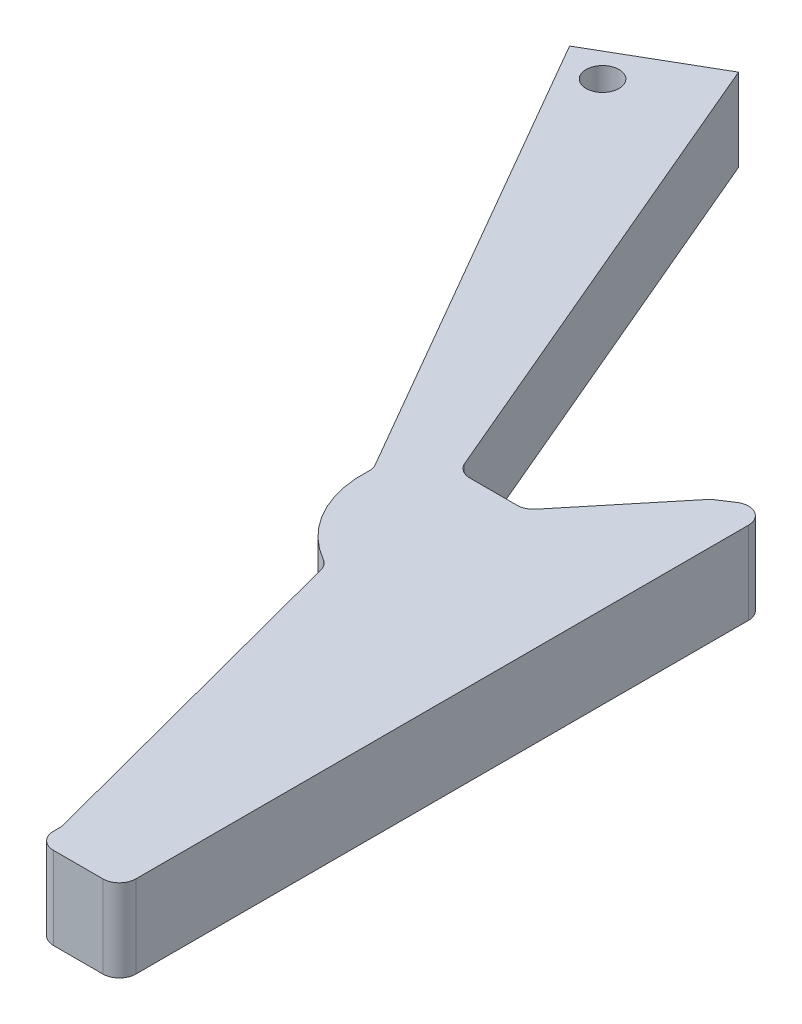
ISO-10303-21;
HEADER;
FILE_DESCRIPTION(('STEP AP214'),'2;1');
FILE_NAME('part.step','',(''),(''),'','','');
FILE_SCHEMA(('AUTOMOTIVE_DESIGN { 1 0 10303 214 1 1 1 1 }'));
ENDSEC;
DATA;
#1=APPLICATION_CONTEXT('core data for automotive mechanical design processes');
#2=APPLICATION_PROTOCOL_DEFINITION('international standard','automotive_design',2000,#1);
#3=PRODUCT_CONTEXT('',#1,'mechanical');
#4=PRODUCT('Part','Part','',(#3));
#5=PRODUCT_RELATED_PRODUCT_CATEGORY('part','',(#4));
#6=PRODUCT_DEFINITION_FORMATION('','',#4);
#7=PRODUCT_DEFINITION_CONTEXT('part definition',#1,'design');
#8=PRODUCT_DEFINITION('design','',#6,#7);
#9=PRODUCT_DEFINITION_SHAPE('','',#8);
#10=(LENGTH_UNIT() NAMED_UNIT(*) SI_UNIT(.MILLI.,.METRE.));
#11=(NAMED_UNIT(*) PLANE_ANGLE_UNIT() SI_UNIT($,.RADIAN.));
#12=(NAMED_UNIT(*) SI_UNIT($,.STERADIAN.) SOLID_ANGLE_UNIT());
#13=UNCERTAINTY_MEASURE_WITH_UNIT(LENGTH_MEASURE(1.E-05),#10,'distance_accuracy_value','');
#14=(GEOMETRIC_REPRESENTATION_CONTEXT(3) GLOBAL_UNCERTAINTY_ASSIGNED_CONTEXT((#13)) GLOBAL_UNIT_ASSIGNED_CONTEXT((#10,
#11,#12)) REPRESENTATION_CONTEXT('',''));
#15=CARTESIAN_POINT('',(0.,0.,0.));
#16=DIRECTION('',(0.,0.,1.));
#17=DIRECTION('',(1.,0.,0.));
#18=AXIS2_PLACEMENT_3D('',#15,#16,#17);
#19=CARTESIAN_POINT('',(46.4442945875548,10.,49.2553340392521));
#20=DIRECTION('',(0.,1.,0.));
#21=DIRECTION('',(0.,0.,1.));
#22=AXIS2_PLACEMENT_3D('',#19,#20,#21);
#23=PLANE('',#22);
#24=DIRECTION('',(0.,0.,-1.));
#25=VECTOR('',#24,1.);
#26=CARTESIAN_POINT('',(62.1731421665861,10.,27.4436003634956));
#27=LINE('',#26,#25);
#28=CARTESIAN_POINT('',(62.1731421665861,10.,105.443600363496));
#29=VERTEX_POINT('',#28);
#30=CARTESIAN_POINT('',(62.1731421665861,10.,31.1510736882238));
#31=VERTEX_POINT('',#30);
#32=EDGE_CURVE('E311',#29,#31,#27,.T.);
#33=ORIENTED_EDGE('',*,*,#32,.T.);
#34=CARTESIAN_POINT('',(60.1731421665861,10.,31.1510736882238));
#35=DIRECTION('',(0.,1.,0.));
#36=DIRECTION('',(0.,0.,1.));
#37=AXIS2_PLACEMENT_3D('',#34,#35,#36);
#38=CIRCLE('',#37,2.);
#39=CARTESIAN_POINT('',(59.0747863932644,10.,29.4796627288213));
#40=VERTEX_POINT('',#39);
#41=EDGE_CURVE('E230',#31,#40,#38,.T.);
#42=ORIENTED_EDGE('',*,*,#41,.T.);
#43=DIRECTION('',(-0.835705479701275,0.,0.549177886660835));
#44=VECTOR('',#43,1.);
#45=CARTESIAN_POINT('',(57.1589092883784,10.,30.7386676834606));
#46=LINE('',#45,#44);
#47=CARTESIAN_POINT('',(57.4130700150903,10.,30.5716477773357));
#48=VERTEX_POINT('',#47);
#49=EDGE_CURVE('E318',#40,#48,#46,.T.);
#50=ORIENTED_EDGE('',*,*,#49,.T.);
#51=CARTESIAN_POINT('',(58.511425788412,10.,32.2430587367382));
#52=DIRECTION('',(0.,1.,0.));
#53=DIRECTION('',(0.,0.,1.));
#54=AXIS2_PLACEMENT_3D('',#51,#52,#53);
#55=CIRCLE('',#54,2.);
#56=CARTESIAN_POINT('',(56.9658842738146,10.,30.9736882523421));
#57=VERTEX_POINT('',#56);
#58=EDGE_CURVE('E228',#48,#57,#55,.T.);
#59=ORIENTED_EDGE('',*,*,#58,.T.);
#60=DIRECTION('',(-0.634685242198068,0.,0.772770757298683));
#61=VECTOR('',#60,1.);
#62=CARTESIAN_POINT('',(47.0039454132093,10.,43.1029998002396));
#63=LINE('',#62,#61);
#64=CARTESIAN_POINT('',(47.604019583574,10.,42.3723702846357));
#65=VERTEX_POINT('',#64);
#66=EDGE_CURVE('E321',#57,#65,#63,.T.);
#67=ORIENTED_EDGE('',*,*,#66,.T.);
#68=CARTESIAN_POINT('',(46.0584780689766,10.,41.1029998002396));
#69=DIRECTION('',(0.,1.,0.));
#70=DIRECTION('',(0.,0.,1.));
#71=AXIS2_PLACEMENT_3D('',#68,#69,#70);
#72=CIRCLE('',#71,2.);
#73=CARTESIAN_POINT('',(46.0584780689766,10.,43.1029998002396));
#74=VERTEX_POINT('',#73);
#75=EDGE_CURVE('E59',#65,#74,#72,.F.);
#76=ORIENTED_EDGE('',*,*,#75,.T.);
#77=DIRECTION('',(-1.,0.,0.));
#78=VECTOR('',#77,1.);
#79=CARTESIAN_POINT('',(39.0039454132093,10.,43.1029998002396));
#80=LINE('',#79,#78);
#81=CARTESIAN_POINT('',(40.3277165356007,10.,43.1029998002396));
#82=VERTEX_POINT('',#81);
#83=EDGE_CURVE('E205',#74,#82,#80,.T.);
#84=ORIENTED_EDGE('',*,*,#83,.T.);
#85=CARTESIAN_POINT('',(40.3277165356007,10.,41.1029998002396));
#86=DIRECTION('',(0.,1.,0.));
#87=DIRECTION('',(0.,0.,1.));
#88=AXIS2_PLACEMENT_3D('',#85,#86,#87);
#89=CIRCLE('',#88,2.);
#90=CARTESIAN_POINT('',(38.4867068286958,10.,41.8844620572181));
#91=VERTEX_POINT('',#90);
#92=EDGE_CURVE('E181',#82,#91,#89,.F.);
#93=ORIENTED_EDGE('',*,*,#92,.T.);
#94=DIRECTION('',(-0.390731128489278,0.,-0.920504853452438));
#95=VECTOR('',#94,1.);
#96=CARTESIAN_POINT('',(13.9971531898955,10.,-15.8093108207165));
#97=LINE('',#96,#95);
#98=CARTESIAN_POINT('',(13.9971531898955,10.,-15.8093108207165));
#99=VERTEX_POINT('',#98);
#100=EDGE_CURVE('E173',#91,#99,#97,.T.);
#101=ORIENTED_EDGE('',*,*,#100,.T.);
#102=DIRECTION('',(-0.866025403784438,0.,0.500000000000002));
#103=VECTOR('',#102,1.);
#104=CARTESIAN_POINT('',(13.9971531898955,10.,-15.8093108207165));
#105=LINE('',#104,#103);
#106=CARTESIAN_POINT('',(1.00677213312894,10.,-8.30931082071648));
#107=VERTEX_POINT('',#106);
#108=EDGE_CURVE('E178',#99,#107,#105,.T.);
#109=ORIENTED_EDGE('',*,*,#108,.T.);
#110=DIRECTION('',(0.500000000000004,0.,0.866025403784436));
#111=VECTOR('',#110,1.);
#112=CARTESIAN_POINT('',(1.00677213312894,10.,-8.30931082071648));
#113=LINE('',#112,#111);
#114=CARTESIAN_POINT('',(33.1981030657169,10.,47.4477099177889));
#115=VERTEX_POINT('',#114);
#116=EDGE_CURVE('E195',#107,#115,#113,.T.);
#117=ORIENTED_EDGE('',*,*,#116,.T.);
#118=CARTESIAN_POINT('',(31.4660522581481,10.,48.4477099177889));
#119=DIRECTION('',(0.,1.,0.));
#120=DIRECTION('',(0.,0.,1.));
#121=AXIS2_PLACEMENT_3D('',#118,#119,#120);
#122=CIRCLE('',#121,2.);
#123=CARTESIAN_POINT('',(33.4631512354023,10.,48.555393133984));
#124=VERTEX_POINT('',#123);
#125=EDGE_CURVE('E273',#115,#124,#122,.F.);
#126=ORIENTED_EDGE('',*,*,#125,.T.);
#127=CARTESIAN_POINT('',(46.4442945875548,10.,49.2553340392521));
#128=DIRECTION('',(0.,1.,0.));
#129=DIRECTION('',(0.,0.,1.));
#130=AXIS2_PLACEMENT_3D('',#127,#128,#129);
#131=CIRCLE('',#130,13.);
#132=CARTESIAN_POINT('',(39.9980836871193,10.,60.5445485835464));
#133=VERTEX_POINT('',#132);
#134=EDGE_CURVE('E313',#124,#133,#131,.T.);
#135=ORIENTED_EDGE('',*,*,#134,.T.);
#136=CARTESIAN_POINT('',(39.0063589332061,10.,62.2813508211302));
#137=DIRECTION('',(0.,1.,0.));
#138=DIRECTION('',(0.,0.,1.));
#139=AXIS2_PLACEMENT_3D('',#136,#137,#138);
#140=CIRCLE('',#139,2.);
#141=CARTESIAN_POINT('',(40.9404705039974,10.,61.7722217297089));
#142=VERTEX_POINT('',#141);
#143=EDGE_CURVE('E277',#133,#142,#140,.F.);
#144=ORIENTED_EDGE('',*,*,#143,.T.);
#145=DIRECTION('',(0.254564545710623,0.,0.967055785395622));
#146=VECTOR('',#145,1.);
#147=CARTESIAN_POINT('',(52.1731421665861,10.,104.443600363496));
#148=LINE('',#147,#146);
#149=CARTESIAN_POINT('',(52.1072537373773,10.,104.193299260178));
#150=VERTEX_POINT('',#149);
#151=EDGE_CURVE('E304',#142,#150,#148,.T.);
#152=ORIENTED_EDGE('',*,*,#151,.T.);
#153=CARTESIAN_POINT('',(50.1731421665861,10.,104.702428351599));
#154=DIRECTION('',(0.,1.,0.));
#155=DIRECTION('',(0.,0.,1.));
#156=AXIS2_PLACEMENT_3D('',#153,#154,#155);
#157=CIRCLE('',#156,2.);
#158=CARTESIAN_POINT('',(52.1731421665861,10.,104.702428351599));
#159=VERTEX_POINT('',#158);
#160=EDGE_CURVE('E11',#150,#159,#157,.F.);
#161=ORIENTED_EDGE('',*,*,#160,.T.);
#162=DIRECTION('',(0.,0.,1.));
#163=VECTOR('',#162,1.);
#164=CARTESIAN_POINT('',(52.1731421665861,10.,107.443600363496));
#165=LINE('',#164,#163);
#166=CARTESIAN_POINT('',(52.1731421665861,10.,105.443600363496));
#167=VERTEX_POINT('',#166);
#168=EDGE_CURVE('E302',#159,#167,#165,.T.);
#169=ORIENTED_EDGE('',*,*,#168,.T.);
#170=CARTESIAN_POINT('',(54.1731421665861,10.,105.443600363496));
#171=DIRECTION('',(0.,1.,0.));
#172=DIRECTION('',(0.,0.,1.));
#173=AXIS2_PLACEMENT_3D('',#170,#171,#172);
#174=CIRCLE('',#173,2.);
#175=CARTESIAN_POINT('',(54.1731421665861,10.,107.443600363496));
#176=VERTEX_POINT('',#175);
#177=EDGE_CURVE('E226',#167,#176,#174,.T.);
#178=ORIENTED_EDGE('',*,*,#177,.T.);
#179=DIRECTION('',(1.,0.,0.));
#180=VECTOR('',#179,1.);
#181=CARTESIAN_POINT('',(62.1731421665861,10.,107.443600363496));
#182=LINE('',#181,#180);
#183=CARTESIAN_POINT('',(60.1731421665861,10.,107.443600363496));
#184=VERTEX_POINT('',#183);
#185=EDGE_CURVE('E308',#176,#184,#182,.T.);
#186=ORIENTED_EDGE('',*,*,#185,.T.);
#187=CARTESIAN_POINT('',(60.1731421665861,10.,105.443600363496));
#188=DIRECTION('',(0.,1.,0.));
#189=DIRECTION('',(0.,0.,1.));
#190=AXIS2_PLACEMENT_3D('',#187,#188,#189);
#191=CIRCLE('',#190,2.);
#192=EDGE_CURVE('E224',#184,#29,#191,.T.);
#193=ORIENTED_EDGE('',*,*,#192,.T.);
#194=EDGE_LOOP('',(#33,#42,#50,#59,#67,#76,#84,#93,#101,#109,#117,#126,#135,#144,#152,#161,#169,
#178,#186,#193));
#195=FACE_BOUND('',#194,.T.);
#196=CARTESIAN_POINT('',(6.4708737482667,10.,-6.84520920557874));
#197=DIRECTION('',(0.,1.,0.));
#198=DIRECTION('',(0.,0.,1.));
#199=AXIS2_PLACEMENT_3D('',#196,#197,#198);
#200=CIRCLE('',#199,2.00000000000001);
#201=CARTESIAN_POINT('',(6.4708737482667,10.,-4.84520920557873));
#202=VERTEX_POINT('',#201);
#203=EDGE_CURVE('E326',#202,#202,#200,.T.);
#204=ORIENTED_EDGE('',*,*,#203,.F.);
#205=EDGE_LOOP('',(#204));
#206=FACE_BOUND('',#205,.T.);
#207=ADVANCED_FACE('F37',(#195,#206),#23,.T.);
#208=CARTESIAN_POINT('',(46.4442945875548,0.,49.2553340392521));
#209=DIRECTION('',(0.,1.,0.));
#210=DIRECTION('',(0.,0.,1.));
#211=AXIS2_PLACEMENT_3D('',#208,#209,#210);
#212=PLANE('',#211);
#213=DIRECTION('',(-0.835705479701275,0.,0.549177886660835));
#214=VECTOR('',#213,1.);
#215=CARTESIAN_POINT('',(57.1589092883784,0.,30.7386676834606));
#216=LINE('',#215,#214);
#217=CARTESIAN_POINT('',(59.0747863932644,0.,29.4796627288213));
#218=VERTEX_POINT('',#217);
#219=CARTESIAN_POINT('',(57.4130700150903,0.,30.5716477773357));
#220=VERTEX_POINT('',#219);
#221=EDGE_CURVE('E340',#218,#220,#216,.T.);
#222=ORIENTED_EDGE('',*,*,#221,.F.);
#223=CARTESIAN_POINT('',(60.1731421665861,0.,31.1510736882238));
#224=DIRECTION('',(0.,1.,0.));
#225=DIRECTION('',(0.,0.,1.));
#226=AXIS2_PLACEMENT_3D('',#223,#224,#225);
#227=CIRCLE('',#226,2.);
#228=CARTESIAN_POINT('',(62.1731421665861,0.,31.1510736882238));
#229=VERTEX_POINT('',#228);
#230=EDGE_CURVE('E217',#218,#229,#227,.F.);
#231=ORIENTED_EDGE('',*,*,#230,.T.);
#232=DIRECTION('',(0.,0.,-1.));
#233=VECTOR('',#232,1.);
#234=CARTESIAN_POINT('',(62.1731421665861,0.,27.4436003634956));
#235=LINE('',#234,#233);
#236=CARTESIAN_POINT('',(62.1731421665861,0.,105.443600363496));
#237=VERTEX_POINT('',#236);
#238=EDGE_CURVE('E337',#237,#229,#235,.T.);
#239=ORIENTED_EDGE('',*,*,#238,.F.);
#240=CARTESIAN_POINT('',(60.1731421665861,0.,105.443600363496));
#241=DIRECTION('',(0.,1.,0.));
#242=DIRECTION('',(0.,0.,1.));
#243=AXIS2_PLACEMENT_3D('',#240,#241,#242);
#244=CIRCLE('',#243,2.);
#245=CARTESIAN_POINT('',(60.1731421665861,0.,107.443600363496));
#246=VERTEX_POINT('',#245);
#247=EDGE_CURVE('E211',#237,#246,#244,.F.);
#248=ORIENTED_EDGE('',*,*,#247,.T.);
#249=DIRECTION('',(1.,0.,0.));
#250=VECTOR('',#249,1.);
#251=CARTESIAN_POINT('',(62.1731421665861,0.,107.443600363496));
#252=LINE('',#251,#250);
#253=CARTESIAN_POINT('',(54.1731421665861,0.,107.443600363496));
#254=VERTEX_POINT('',#253);
#255=EDGE_CURVE('E334',#254,#246,#252,.T.);
#256=ORIENTED_EDGE('',*,*,#255,.F.);
#257=CARTESIAN_POINT('',(54.1731421665861,0.,105.443600363496));
#258=DIRECTION('',(0.,1.,0.));
#259=DIRECTION('',(0.,0.,1.));
#260=AXIS2_PLACEMENT_3D('',#257,#258,#259);
#261=CIRCLE('',#260,2.);
#262=CARTESIAN_POINT('',(52.1731421665861,0.,105.443600363496));
#263=VERTEX_POINT('',#262);
#264=EDGE_CURVE('E213',#254,#263,#261,.F.);
#265=ORIENTED_EDGE('',*,*,#264,.T.);
#266=DIRECTION('',(0.,0.,1.));
#267=VECTOR('',#266,1.);
#268=CARTESIAN_POINT('',(52.1731421665861,0.,107.443600363496));
#269=LINE('',#268,#267);
#270=CARTESIAN_POINT('',(52.1731421665861,0.,104.702428351599));
#271=VERTEX_POINT('',#270);
#272=EDGE_CURVE('E287',#271,#263,#269,.T.);
#273=ORIENTED_EDGE('',*,*,#272,.F.);
#274=CARTESIAN_POINT('',(50.1731421665861,0.,104.702428351599));
#275=DIRECTION('',(0.,1.,0.));
#276=DIRECTION('',(0.,0.,1.));
#277=AXIS2_PLACEMENT_3D('',#274,#275,#276);
#278=CIRCLE('',#277,2.);
#279=CARTESIAN_POINT('',(52.1072537373773,0.,104.193299260178));
#280=VERTEX_POINT('',#279);
#281=EDGE_CURVE('E45',#271,#280,#278,.T.);
#282=ORIENTED_EDGE('',*,*,#281,.T.);
#283=DIRECTION('',(0.254564545710623,0.,0.967055785395622));
#284=VECTOR('',#283,1.);
#285=CARTESIAN_POINT('',(52.1731421665861,0.,104.443600363496));
#286=LINE('',#285,#284);
#287=CARTESIAN_POINT('',(40.9404705039974,0.,61.7722217297089));
#288=VERTEX_POINT('',#287);
#289=EDGE_CURVE('E285',#288,#280,#286,.T.);
#290=ORIENTED_EDGE('',*,*,#289,.F.);
#291=CARTESIAN_POINT('',(39.0063589332061,0.,62.2813508211302));
#292=DIRECTION('',(0.,1.,0.));
#293=DIRECTION('',(0.,0.,1.));
#294=AXIS2_PLACEMENT_3D('',#291,#292,#293);
#295=CIRCLE('',#294,2.);
#296=CARTESIAN_POINT('',(39.9980836871193,0.,60.5445485835464));
#297=VERTEX_POINT('',#296);
#298=EDGE_CURVE('E275',#288,#297,#295,.T.);
#299=ORIENTED_EDGE('',*,*,#298,.T.);
#300=CARTESIAN_POINT('',(46.4442945875548,0.,49.2553340392521));
#301=DIRECTION('',(0.,1.,0.));
#302=DIRECTION('',(0.,0.,1.));
#303=AXIS2_PLACEMENT_3D('',#300,#301,#302);
#304=CIRCLE('',#303,13.);
#305=CARTESIAN_POINT('',(33.4631512354023,0.,48.555393133984));
#306=VERTEX_POINT('',#305);
#307=EDGE_CURVE('E296',#306,#297,#304,.T.);
#308=ORIENTED_EDGE('',*,*,#307,.F.);
#309=CARTESIAN_POINT('',(31.4660522581481,0.,48.4477099177889));
#310=DIRECTION('',(0.,1.,0.));
#311=DIRECTION('',(0.,0.,1.));
#312=AXIS2_PLACEMENT_3D('',#309,#310,#311);
#313=CIRCLE('',#312,2.);
#314=CARTESIAN_POINT('',(33.1981030657169,0.,47.4477099177889));
#315=VERTEX_POINT('',#314);
#316=EDGE_CURVE('E271',#306,#315,#313,.T.);
#317=ORIENTED_EDGE('',*,*,#316,.T.);
#318=DIRECTION('',(0.500000000000004,0.,0.866025403784436));
#319=VECTOR('',#318,1.);
#320=CARTESIAN_POINT('',(1.00677213312894,0.,-8.30931082071648));
#321=LINE('',#320,#319);
#322=CARTESIAN_POINT('',(1.00677213312894,0.,-8.30931082071648));
#323=VERTEX_POINT('',#322);
#324=EDGE_CURVE('E328',#323,#315,#321,.T.);
#325=ORIENTED_EDGE('',*,*,#324,.F.);
#326=DIRECTION('',(-0.866025403784438,0.,0.500000000000002));
#327=VECTOR('',#326,1.);
#328=CARTESIAN_POINT('',(13.9971531898955,0.,-15.8093108207165));
#329=LINE('',#328,#327);
#330=CARTESIAN_POINT('',(13.9971531898955,0.,-15.8093108207165));
#331=VERTEX_POINT('',#330);
#332=EDGE_CURVE('E325',#331,#323,#329,.T.);
#333=ORIENTED_EDGE('',*,*,#332,.F.);
#334=DIRECTION('',(-0.390731128489278,0.,-0.920504853452438));
#335=VECTOR('',#334,1.);
#336=CARTESIAN_POINT('',(13.9971531898955,0.,-15.8093108207165));
#337=LINE('',#336,#335);
#338=CARTESIAN_POINT('',(38.4867068286958,0.,41.8844620572181));
#339=VERTEX_POINT('',#338);
#340=EDGE_CURVE('E199',#339,#331,#337,.T.);
#341=ORIENTED_EDGE('',*,*,#340,.F.);
#342=CARTESIAN_POINT('',(40.3277165356007,0.,41.1029998002396));
#343=DIRECTION('',(0.,1.,0.));
#344=DIRECTION('',(0.,0.,1.));
#345=AXIS2_PLACEMENT_3D('',#342,#343,#344);
#346=CIRCLE('',#345,2.);
#347=CARTESIAN_POINT('',(40.3277165356007,0.,43.1029998002396));
#348=VERTEX_POINT('',#347);
#349=EDGE_CURVE('E268',#339,#348,#346,.T.);
#350=ORIENTED_EDGE('',*,*,#349,.T.);
#351=DIRECTION('',(-1.,0.,0.));
#352=VECTOR('',#351,1.);
#353=CARTESIAN_POINT('',(39.0039454132093,0.,43.1029998002396));
#354=LINE('',#353,#352);
#355=CARTESIAN_POINT('',(46.0584780689766,0.,43.1029998002396));
#356=VERTEX_POINT('',#355);
#357=EDGE_CURVE('E186',#356,#348,#354,.T.);
#358=ORIENTED_EDGE('',*,*,#357,.F.);
#359=CARTESIAN_POINT('',(46.0584780689766,0.,41.1029998002396));
#360=DIRECTION('',(0.,1.,0.));
#361=DIRECTION('',(0.,0.,1.));
#362=AXIS2_PLACEMENT_3D('',#359,#360,#361);
#363=CIRCLE('',#362,2.);
#364=CARTESIAN_POINT('',(47.604019583574,0.,42.3723702846357));
#365=VERTEX_POINT('',#364);
#366=EDGE_CURVE('E265',#356,#365,#363,.T.);
#367=ORIENTED_EDGE('',*,*,#366,.T.);
#368=DIRECTION('',(-0.634685242198068,0.,0.772770757298683));
#369=VECTOR('',#368,1.);
#370=CARTESIAN_POINT('',(47.0039454132093,0.,43.1029998002396));
#371=LINE('',#370,#369);
#372=CARTESIAN_POINT('',(56.9658842738146,0.,30.9736882523421));
#373=VERTEX_POINT('',#372);
#374=EDGE_CURVE('E343',#373,#365,#371,.T.);
#375=ORIENTED_EDGE('',*,*,#374,.F.);
#376=CARTESIAN_POINT('',(58.511425788412,0.,32.2430587367382));
#377=DIRECTION('',(0.,1.,0.));
#378=DIRECTION('',(0.,0.,1.));
#379=AXIS2_PLACEMENT_3D('',#376,#377,#378);
#380=CIRCLE('',#379,2.);
#381=EDGE_CURVE('E215',#373,#220,#380,.F.);
#382=ORIENTED_EDGE('',*,*,#381,.T.);
#383=EDGE_LOOP('',(#222,#231,#239,#248,#256,#265,#273,#282,#290,#299,#308,#317,#325,#333,#341,
#350,#358,#367,#375,#382));
#384=FACE_BOUND('',#383,.T.);
#385=CARTESIAN_POINT('',(6.4708737482667,0.,-6.84520920557874));
#386=DIRECTION('',(0.,1.,0.));
#387=DIRECTION('',(0.,0.,1.));
#388=AXIS2_PLACEMENT_3D('',#385,#386,#387);
#389=CIRCLE('',#388,2.00000000000001);
#390=CARTESIAN_POINT('',(6.4708737482667,0.,-4.84520920557873));
#391=VERTEX_POINT('',#390);
#392=EDGE_CURVE('E358',#391,#391,#389,.T.);
#393=ORIENTED_EDGE('',*,*,#392,.T.);
#394=EDGE_LOOP('',(#393));
#395=FACE_BOUND('',#394,.T.);
#396=ADVANCED_FACE('F283',(#384,#395),#212,.F.);
#397=CARTESIAN_POINT('',(13.9971531898955,10.,-15.8093108207165));
#398=DIRECTION('',(-0.920504853452438,0.,0.390731128489278));
#399=DIRECTION('',(0.390731128489278,0.,0.920504853452438));
#400=AXIS2_PLACEMENT_3D('',#397,#398,#399);
#401=PLANE('',#400);
#402=ORIENTED_EDGE('',*,*,#100,.F.);
#403=DIRECTION('',(0.,-1.,0.));
#404=VECTOR('',#403,1.);
#405=CARTESIAN_POINT('',(38.4867068286958,0.,41.8844620572181));
#406=LINE('',#405,#404);
#407=EDGE_CURVE('E241',#91,#339,#406,.T.);
#408=ORIENTED_EDGE('',*,*,#407,.T.);
#409=ORIENTED_EDGE('',*,*,#340,.T.);
#410=DIRECTION('',(0.,-1.,0.));
#411=VECTOR('',#410,1.);
#412=CARTESIAN_POINT('',(13.9971531898955,10.,-15.8093108207165));
#413=LINE('',#412,#411);
#414=EDGE_CURVE('E191',#99,#331,#413,.T.);
#415=ORIENTED_EDGE('',*,*,#414,.F.);
#416=EDGE_LOOP('',(#402,#408,#409,#415));
#417=FACE_BOUND('',#416,.T.);
#418=ADVANCED_FACE('F197',(#417),#401,.F.);
#419=CARTESIAN_POINT('',(13.9971531898955,10.,-15.8093108207165));
#420=DIRECTION('',(0.500000000000002,0.,0.866025403784438));
#421=DIRECTION('',(0.866025403784438,0.,-0.500000000000002));
#422=AXIS2_PLACEMENT_3D('',#419,#420,#421);
#423=PLANE('',#422);
#424=ORIENTED_EDGE('',*,*,#332,.T.);
#425=DIRECTION('',(0.,-1.,0.));
#426=VECTOR('',#425,1.);
#427=CARTESIAN_POINT('',(1.00677213312894,10.,-8.30931082071648));
#428=LINE('',#427,#426);
#429=EDGE_CURVE('E193',#107,#323,#428,.T.);
#430=ORIENTED_EDGE('',*,*,#429,.F.);
#431=ORIENTED_EDGE('',*,*,#108,.F.);
#432=ORIENTED_EDGE('',*,*,#414,.T.);
#433=EDGE_LOOP('',(#424,#430,#431,#432));
#434=FACE_BOUND('',#433,.T.);
#435=ADVANCED_FACE('F190',(#434),#423,.F.);
#436=CARTESIAN_POINT('',(1.00677213312894,10.,-8.30931082071648));
#437=DIRECTION('',(0.866025403784436,0.,-0.500000000000004));
#438=DIRECTION('',(-0.500000000000005,0.,-0.866025403784436));
#439=AXIS2_PLACEMENT_3D('',#436,#437,#438);
#440=PLANE('',#439);
#441=ORIENTED_EDGE('',*,*,#324,.T.);
#442=DIRECTION('',(0.,1.,0.));
#443=VECTOR('',#442,1.);
#444=CARTESIAN_POINT('',(33.1981030657169,10.,47.4477099177889));
#445=LINE('',#444,#443);
#446=EDGE_CURVE('E248',#315,#115,#445,.T.);
#447=ORIENTED_EDGE('',*,*,#446,.T.);
#448=ORIENTED_EDGE('',*,*,#116,.F.);
#449=ORIENTED_EDGE('',*,*,#429,.T.);
#450=EDGE_LOOP('',(#441,#447,#448,#449));
#451=FACE_BOUND('',#450,.T.);
#452=ADVANCED_FACE('F352',(#451),#440,.F.);
#453=CARTESIAN_POINT('',(46.4442945875548,10.,49.2553340392521));
#454=DIRECTION('',(0.,-1.,0.));
#455=DIRECTION('',(0.,0.,-1.));
#456=AXIS2_PLACEMENT_3D('',#453,#454,#455);
#457=CYLINDRICAL_SURFACE('',#456,13.);
#458=ORIENTED_EDGE('',*,*,#134,.F.);
#459=DIRECTION('',(0.,-1.,0.));
#460=VECTOR('',#459,1.);
#461=CARTESIAN_POINT('',(33.4631512354023,10.,48.555393133984));
#462=LINE('',#461,#460);
#463=EDGE_CURVE('E245',#124,#306,#462,.T.);
#464=ORIENTED_EDGE('',*,*,#463,.T.);
#465=ORIENTED_EDGE('',*,*,#307,.T.);
#466=DIRECTION('',(0.,-1.,0.));
#467=VECTOR('',#466,1.);
#468=CARTESIAN_POINT('',(39.9980836871193,10.,60.5445485835464));
#469=LINE('',#468,#467);
#470=EDGE_CURVE('E243',#297,#133,#469,.F.);
#471=ORIENTED_EDGE('',*,*,#470,.T.);
#472=EDGE_LOOP('',(#458,#464,#465,#471));
#473=FACE_BOUND('',#472,.T.);
#474=ADVANCED_FACE('F396',(#473),#457,.T.);
#475=CARTESIAN_POINT('',(52.1731421665861,10.,104.443600363496));
#476=DIRECTION('',(0.967055785395623,0.,-0.254564545710623));
#477=DIRECTION('',(-0.254564545710623,0.,-0.967055785395623));
#478=AXIS2_PLACEMENT_3D('',#475,#476,#477);
#479=PLANE('',#478);
#480=ORIENTED_EDGE('',*,*,#151,.F.);
#481=DIRECTION('',(0.,1.,0.));
#482=VECTOR('',#481,1.);
#483=CARTESIAN_POINT('',(40.9404705039974,0.,61.7722217297089));
#484=LINE('',#483,#482);
#485=EDGE_CURVE('E252',#142,#288,#484,.F.);
#486=ORIENTED_EDGE('',*,*,#485,.T.);
#487=ORIENTED_EDGE('',*,*,#289,.T.);
#488=DIRECTION('',(0.,-1.,0.));
#489=VECTOR('',#488,1.);
#490=CARTESIAN_POINT('',(52.1072537373773,10.,104.193299260178));
#491=LINE('',#490,#489);
#492=EDGE_CURVE('E250',#280,#150,#491,.F.);
#493=ORIENTED_EDGE('',*,*,#492,.T.);
#494=EDGE_LOOP('',(#480,#486,#487,#493));
#495=FACE_BOUND('',#494,.T.);
#496=ADVANCED_FACE('F293',(#495),#479,.F.);
#497=CARTESIAN_POINT('',(52.1731421665861,10.,107.443600363496));
#498=DIRECTION('',(1.,0.,0.));
#499=DIRECTION('',(0.,0.,-1.));
#500=AXIS2_PLACEMENT_3D('',#497,#498,#499);
#501=PLANE('',#500);
#502=ORIENTED_EDGE('',*,*,#168,.F.);
#503=DIRECTION('',(0.,-1.,0.));
#504=VECTOR('',#503,1.);
#505=CARTESIAN_POINT('',(52.1731421665861,0.,104.702428351599));
#506=LINE('',#505,#504);
#507=EDGE_CURVE('E257',#159,#271,#506,.T.);
#508=ORIENTED_EDGE('',*,*,#507,.T.);
#509=ORIENTED_EDGE('',*,*,#272,.T.);
#510=DIRECTION('',(0.,-1.,0.));
#511=VECTOR('',#510,1.);
#512=CARTESIAN_POINT('',(52.1731421665861,10.,105.443600363496));
#513=LINE('',#512,#511);
#514=EDGE_CURVE('E255',#263,#167,#513,.F.);
#515=ORIENTED_EDGE('',*,*,#514,.T.);
#516=EDGE_LOOP('',(#502,#508,#509,#515));
#517=FACE_BOUND('',#516,.T.);
#518=ADVANCED_FACE('F306',(#517),#501,.F.);
#519=CARTESIAN_POINT('',(62.1731421665861,10.,107.443600363496));
#520=DIRECTION('',(0.,0.,-1.));
#521=DIRECTION('',(-1.,0.,0.));
#522=AXIS2_PLACEMENT_3D('',#519,#520,#521);
#523=PLANE('',#522);
#524=ORIENTED_EDGE('',*,*,#185,.F.);
#525=DIRECTION('',(0.,-1.,0.));
#526=VECTOR('',#525,1.);
#527=CARTESIAN_POINT('',(54.1731421665861,10.,107.443600363496));
#528=LINE('',#527,#526);
#529=EDGE_CURVE('E262',#176,#254,#528,.T.);
#530=ORIENTED_EDGE('',*,*,#529,.T.);
#531=ORIENTED_EDGE('',*,*,#255,.T.);
#532=DIRECTION('',(0.,-1.,0.));
#533=VECTOR('',#532,1.);
#534=CARTESIAN_POINT('',(60.1731421665861,10.,107.443600363496));
#535=LINE('',#534,#533);
#536=EDGE_CURVE('E260',#246,#184,#535,.F.);
#537=ORIENTED_EDGE('',*,*,#536,.T.);
#538=EDGE_LOOP('',(#524,#530,#531,#537));
#539=FACE_BOUND('',#538,.T.);
#540=ADVANCED_FACE('F387',(#539),#523,.F.);
#541=CARTESIAN_POINT('',(62.1731421665861,10.,27.4436003634956));
#542=DIRECTION('',(-1.,0.,0.));
#543=DIRECTION('',(0.,0.,1.));
#544=AXIS2_PLACEMENT_3D('',#541,#542,#543);
#545=PLANE('',#544);
#546=ORIENTED_EDGE('',*,*,#238,.T.);
#547=DIRECTION('',(0.,-1.,0.));
#548=VECTOR('',#547,1.);
#549=CARTESIAN_POINT('',(62.1731421665861,10.,31.1510736882238));
#550=LINE('',#549,#548);
#551=EDGE_CURVE('E222',#229,#31,#550,.F.);
#552=ORIENTED_EDGE('',*,*,#551,.T.);
#553=ORIENTED_EDGE('',*,*,#32,.F.);
#554=DIRECTION('',(0.,-1.,0.));
#555=VECTOR('',#554,1.);
#556=CARTESIAN_POINT('',(62.1731421665861,10.,105.443600363496));
#557=LINE('',#556,#555);
#558=EDGE_CURVE('E219',#29,#237,#557,.T.);
#559=ORIENTED_EDGE('',*,*,#558,.T.);
#560=EDGE_LOOP('',(#546,#552,#553,#559));
#561=FACE_BOUND('',#560,.T.);
#562=ADVANCED_FACE('F383',(#561),#545,.F.);
#563=CARTESIAN_POINT('',(57.1589092883784,10.,30.7386676834606));
#564=DIRECTION('',(0.549177886660835,0.,0.835705479701276));
#565=DIRECTION('',(0.835705479701276,0.,-0.549177886660835));
#566=AXIS2_PLACEMENT_3D('',#563,#564,#565);
#567=PLANE('',#566);
#568=ORIENTED_EDGE('',*,*,#49,.F.);
#569=DIRECTION('',(0.,-1.,0.));
#570=VECTOR('',#569,1.);
#571=CARTESIAN_POINT('',(59.0747863932644,10.,29.4796627288213));
#572=LINE('',#571,#570);
#573=EDGE_CURVE('E203',#40,#218,#572,.T.);
#574=ORIENTED_EDGE('',*,*,#573,.T.);
#575=ORIENTED_EDGE('',*,*,#221,.T.);
#576=DIRECTION('',(0.,-1.,0.));
#577=VECTOR('',#576,1.);
#578=CARTESIAN_POINT('',(57.4130700150903,10.,30.5716477773357));
#579=LINE('',#578,#577);
#580=EDGE_CURVE('E201',#220,#48,#579,.F.);
#581=ORIENTED_EDGE('',*,*,#580,.T.);
#582=EDGE_LOOP('',(#568,#574,#575,#581));
#583=FACE_BOUND('',#582,.T.);
#584=ADVANCED_FACE('F379',(#583),#567,.F.);
#585=CARTESIAN_POINT('',(47.0039454132093,10.,43.1029998002396));
#586=DIRECTION('',(0.772770757298683,0.,0.634685242198068));
#587=DIRECTION('',(0.634685242198068,0.,-0.772770757298683));
#588=AXIS2_PLACEMENT_3D('',#585,#586,#587);
#589=PLANE('',#588);
#590=ORIENTED_EDGE('',*,*,#66,.F.);
#591=DIRECTION('',(0.,-1.,0.));
#592=VECTOR('',#591,1.);
#593=CARTESIAN_POINT('',(56.9658842738146,10.,30.9736882523421));
#594=LINE('',#593,#592);
#595=EDGE_CURVE('E234',#57,#373,#594,.T.);
#596=ORIENTED_EDGE('',*,*,#595,.T.);
#597=ORIENTED_EDGE('',*,*,#374,.T.);
#598=DIRECTION('',(0.,-1.,0.));
#599=VECTOR('',#598,1.);
#600=CARTESIAN_POINT('',(47.604019583574,10.,42.3723702846357));
#601=LINE('',#600,#599);
#602=EDGE_CURVE('E232',#365,#65,#601,.F.);
#603=ORIENTED_EDGE('',*,*,#602,.T.);
#604=EDGE_LOOP('',(#590,#596,#597,#603));
#605=FACE_BOUND('',#604,.T.);
#606=ADVANCED_FACE('F376',(#605),#589,.F.);
#607=CARTESIAN_POINT('',(39.0039454132093,10.,43.1029998002396));
#608=DIRECTION('',(0.,0.,1.));
#609=DIRECTION('',(1.,0.,0.));
#610=AXIS2_PLACEMENT_3D('',#607,#608,#609);
#611=PLANE('',#610);
#612=ORIENTED_EDGE('',*,*,#83,.F.);
#613=DIRECTION('',(0.,-1.,0.));
#614=VECTOR('',#613,1.);
#615=CARTESIAN_POINT('',(46.0584780689766,0.,43.1029998002396));
#616=LINE('',#615,#614);
#617=EDGE_CURVE('E238',#74,#356,#616,.T.);
#618=ORIENTED_EDGE('',*,*,#617,.T.);
#619=ORIENTED_EDGE('',*,*,#357,.T.);
#620=DIRECTION('',(0.,-1.,0.));
#621=VECTOR('',#620,1.);
#622=CARTESIAN_POINT('',(40.3277165356007,10.,43.1029998002396));
#623=LINE('',#622,#621);
#624=EDGE_CURVE('E52',#348,#82,#623,.F.);
#625=ORIENTED_EDGE('',*,*,#624,.T.);
#626=EDGE_LOOP('',(#612,#618,#619,#625));
#627=FACE_BOUND('',#626,.T.);
#628=ADVANCED_FACE('F346',(#627),#611,.F.);
#629=CARTESIAN_POINT('',(6.4708737482667,10.,-6.84520920557874));
#630=DIRECTION('',(0.,-1.,0.));
#631=DIRECTION('',(0.,0.,-1.));
#632=AXIS2_PLACEMENT_3D('',#629,#630,#631);
#633=CYLINDRICAL_SURFACE('',#632,2.00000000000001);
#634=ORIENTED_EDGE('',*,*,#203,.T.);
#635=EDGE_LOOP('',(#634));
#636=FACE_BOUND('',#635,.T.);
#637=ORIENTED_EDGE('',*,*,#392,.F.);
#638=EDGE_LOOP('',(#637));
#639=FACE_BOUND('',#638,.T.);
#640=ADVANCED_FACE('F364',(#636,#639),#633,.F.);
#641=CARTESIAN_POINT('',(60.1731421665861,10.,31.1510736882238));
#642=DIRECTION('',(0.,-1.,0.));
#643=DIRECTION('',(0.,0.,-1.));
#644=AXIS2_PLACEMENT_3D('',#641,#642,#643);
#645=CYLINDRICAL_SURFACE('',#644,2.);
#646=ORIENTED_EDGE('',*,*,#41,.F.);
#647=ORIENTED_EDGE('',*,*,#551,.F.);
#648=ORIENTED_EDGE('',*,*,#230,.F.);
#649=ORIENTED_EDGE('',*,*,#573,.F.);
#650=EDGE_LOOP('',(#646,#647,#648,#649));
#651=FACE_BOUND('',#650,.T.);
#652=ADVANCED_FACE('F406',(#651),#645,.T.);
#653=CARTESIAN_POINT('',(58.511425788412,10.,32.2430587367382));
#654=DIRECTION('',(0.,-1.,0.));
#655=DIRECTION('',(0.,0.,-1.));
#656=AXIS2_PLACEMENT_3D('',#653,#654,#655);
#657=CYLINDRICAL_SURFACE('',#656,2.);
#658=ORIENTED_EDGE('',*,*,#58,.F.);
#659=ORIENTED_EDGE('',*,*,#580,.F.);
#660=ORIENTED_EDGE('',*,*,#381,.F.);
#661=ORIENTED_EDGE('',*,*,#595,.F.);
#662=EDGE_LOOP('',(#658,#659,#660,#661));
#663=FACE_BOUND('',#662,.T.);
#664=ADVANCED_FACE('F409',(#663),#657,.T.);
#665=CARTESIAN_POINT('',(46.0584780689766,10.,41.1029998002396));
#666=DIRECTION('',(0.,1.,0.));
#667=DIRECTION('',(0.,0.,1.));
#668=AXIS2_PLACEMENT_3D('',#665,#666,#667);
#669=CYLINDRICAL_SURFACE('',#668,2.);
#670=ORIENTED_EDGE('',*,*,#75,.F.);
#671=ORIENTED_EDGE('',*,*,#602,.F.);
#672=ORIENTED_EDGE('',*,*,#366,.F.);
#673=ORIENTED_EDGE('',*,*,#617,.F.);
#674=EDGE_LOOP('',(#670,#671,#672,#673));
#675=FACE_BOUND('',#674,.T.);
#676=ADVANCED_FACE('F413',(#675),#669,.F.);
#677=CARTESIAN_POINT('',(40.3277165356007,10.,41.1029998002396));
#678=DIRECTION('',(0.,1.,0.));
#679=DIRECTION('',(0.,0.,1.));
#680=AXIS2_PLACEMENT_3D('',#677,#678,#679);
#681=CYLINDRICAL_SURFACE('',#680,2.);
#682=ORIENTED_EDGE('',*,*,#92,.F.);
#683=ORIENTED_EDGE('',*,*,#624,.F.);
#684=ORIENTED_EDGE('',*,*,#349,.F.);
#685=ORIENTED_EDGE('',*,*,#407,.F.);
#686=EDGE_LOOP('',(#682,#683,#684,#685));
#687=FACE_BOUND('',#686,.T.);
#688=ADVANCED_FACE('F349',(#687),#681,.F.);
#689=CARTESIAN_POINT('',(31.4660522581481,10.,48.4477099177889));
#690=DIRECTION('',(0.,-1.,0.));
#691=DIRECTION('',(0.,0.,-1.));
#692=AXIS2_PLACEMENT_3D('',#689,#690,#691);
#693=CYLINDRICAL_SURFACE('',#692,2.);
#694=ORIENTED_EDGE('',*,*,#125,.F.);
#695=ORIENTED_EDGE('',*,*,#446,.F.);
#696=ORIENTED_EDGE('',*,*,#316,.F.);
#697=ORIENTED_EDGE('',*,*,#463,.F.);
#698=EDGE_LOOP('',(#694,#695,#696,#697));
#699=FACE_BOUND('',#698,.T.);
#700=ADVANCED_FACE('F420',(#699),#693,.F.);
#701=CARTESIAN_POINT('',(39.0063589332061,10.,62.2813508211302));
#702=DIRECTION('',(0.,-1.,0.));
#703=DIRECTION('',(0.,0.,-1.));
#704=AXIS2_PLACEMENT_3D('',#701,#702,#703);
#705=CYLINDRICAL_SURFACE('',#704,2.);
#706=ORIENTED_EDGE('',*,*,#143,.F.);
#707=ORIENTED_EDGE('',*,*,#470,.F.);
#708=ORIENTED_EDGE('',*,*,#298,.F.);
#709=ORIENTED_EDGE('',*,*,#485,.F.);
#710=EDGE_LOOP('',(#706,#707,#708,#709));
#711=FACE_BOUND('',#710,.T.);
#712=ADVANCED_FACE('F423',(#711),#705,.F.);
#713=CARTESIAN_POINT('',(50.1731421665861,10.,104.702428351599));
#714=DIRECTION('',(0.,1.,0.));
#715=DIRECTION('',(0.,0.,1.));
#716=AXIS2_PLACEMENT_3D('',#713,#714,#715);
#717=CYLINDRICAL_SURFACE('',#716,2.);
#718=ORIENTED_EDGE('',*,*,#160,.F.);
#719=ORIENTED_EDGE('',*,*,#492,.F.);
#720=ORIENTED_EDGE('',*,*,#281,.F.);
#721=ORIENTED_EDGE('',*,*,#507,.F.);
#722=EDGE_LOOP('',(#718,#719,#720,#721));
#723=FACE_BOUND('',#722,.T.);
#724=ADVANCED_FACE('F299',(#723),#717,.F.);
#725=CARTESIAN_POINT('',(54.1731421665861,10.,105.443600363496));
#726=DIRECTION('',(0.,-1.,0.));
#727=DIRECTION('',(0.,0.,-1.));
#728=AXIS2_PLACEMENT_3D('',#725,#726,#727);
#729=CYLINDRICAL_SURFACE('',#728,2.);
#730=ORIENTED_EDGE('',*,*,#177,.F.);
#731=ORIENTED_EDGE('',*,*,#514,.F.);
#732=ORIENTED_EDGE('',*,*,#264,.F.);
#733=ORIENTED_EDGE('',*,*,#529,.F.);
#734=EDGE_LOOP('',(#730,#731,#732,#733));
#735=FACE_BOUND('',#734,.T.);
#736=ADVANCED_FACE('F429',(#735),#729,.T.);
#737=CARTESIAN_POINT('',(60.1731421665861,10.,105.443600363496));
#738=DIRECTION('',(0.,-1.,0.));
#739=DIRECTION('',(0.,0.,-1.));
#740=AXIS2_PLACEMENT_3D('',#737,#738,#739);
#741=CYLINDRICAL_SURFACE('',#740,2.);
#742=ORIENTED_EDGE('',*,*,#192,.F.);
#743=ORIENTED_EDGE('',*,*,#536,.F.);
#744=ORIENTED_EDGE('',*,*,#247,.F.);
#745=ORIENTED_EDGE('',*,*,#558,.F.);
#746=EDGE_LOOP('',(#742,#743,#744,#745));
#747=FACE_BOUND('',#746,.T.);
#748=ADVANCED_FACE('F39',(#747),#741,.T.);
#749=CLOSED_SHELL('',(#207,#396,#418,#435,#452,#474,#496,#518,#540,#562,#584,#606,#628,#640,
#652,#664,#676,#688,#700,#712,#724,#736,#748));
#750=MANIFOLD_SOLID_BREP('B2',#749);
#751=ADVANCED_BREP_SHAPE_REPRESENTATION('',(#18,#750),#14);
#752=SHAPE_DEFINITION_REPRESENTATION(#9,#751);
ENDSEC;
END-ISO-10303-21;
